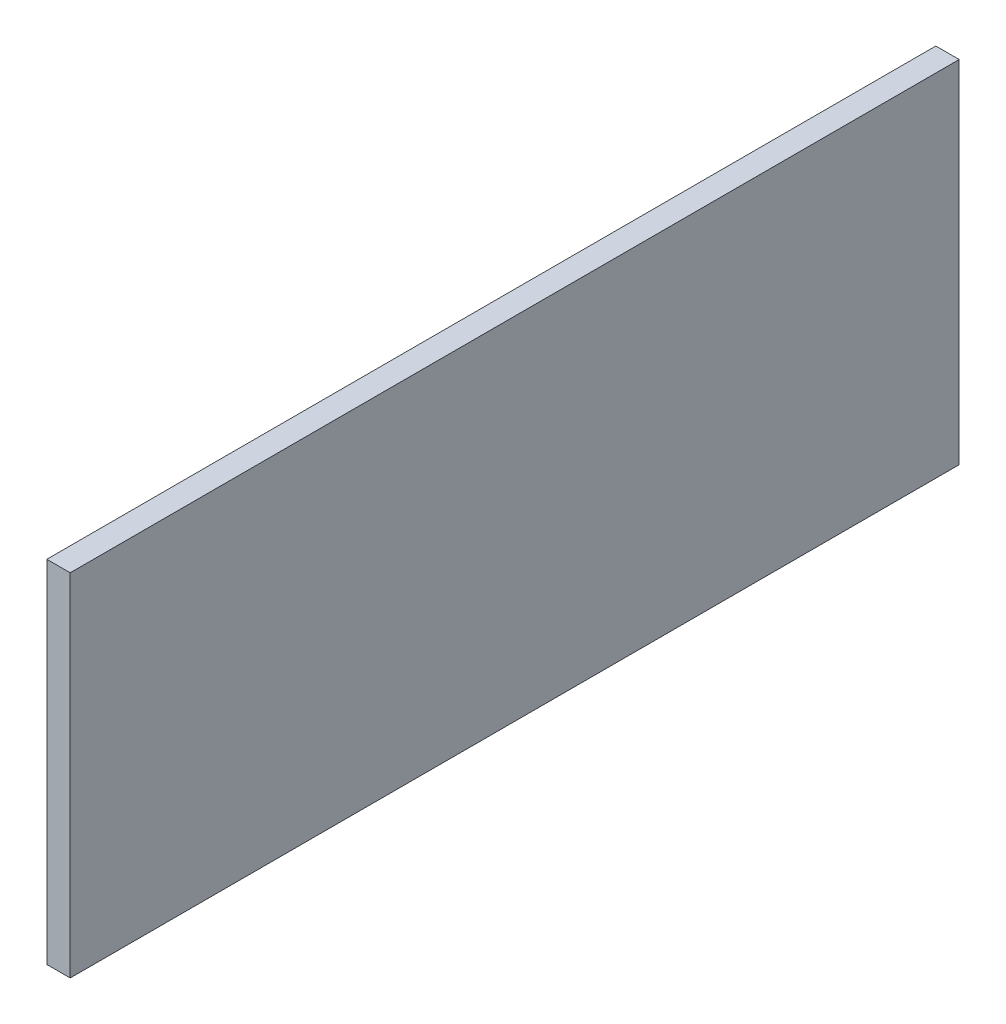
ISO-10303-21;
HEADER;
FILE_DESCRIPTION(('STEP AP214'),'2;1');
FILE_NAME('part.step','',(''),(''),'','','');
FILE_SCHEMA(('AUTOMOTIVE_DESIGN { 1 0 10303 214 1 1 1 1 }'));
ENDSEC;
DATA;
#1=APPLICATION_CONTEXT('core data for automotive mechanical design processes');
#2=APPLICATION_PROTOCOL_DEFINITION('international standard','automotive_design',2000,#1);
#3=PRODUCT_CONTEXT('',#1,'mechanical');
#4=PRODUCT('Part','Part','',(#3));
#5=PRODUCT_RELATED_PRODUCT_CATEGORY('part','',(#4));
#6=PRODUCT_DEFINITION_FORMATION('','',#4);
#7=PRODUCT_DEFINITION_CONTEXT('part definition',#1,'design');
#8=PRODUCT_DEFINITION('design','',#6,#7);
#9=PRODUCT_DEFINITION_SHAPE('','',#8);
#10=(LENGTH_UNIT() NAMED_UNIT(*) SI_UNIT(.MILLI.,.METRE.));
#11=(NAMED_UNIT(*) PLANE_ANGLE_UNIT() SI_UNIT($,.RADIAN.));
#12=(NAMED_UNIT(*) SI_UNIT($,.STERADIAN.) SOLID_ANGLE_UNIT());
#13=UNCERTAINTY_MEASURE_WITH_UNIT(LENGTH_MEASURE(1.E-05),#10,'distance_accuracy_value','');
#14=(GEOMETRIC_REPRESENTATION_CONTEXT(3) GLOBAL_UNCERTAINTY_ASSIGNED_CONTEXT((#13)) GLOBAL_UNIT_ASSIGNED_CONTEXT((#10,
#11,#12)) REPRESENTATION_CONTEXT('',''));
#15=CARTESIAN_POINT('',(0.,0.,0.));
#16=DIRECTION('',(0.,0.,1.));
#17=DIRECTION('',(1.,0.,0.));
#18=AXIS2_PLACEMENT_3D('',#15,#16,#17);
#19=CARTESIAN_POINT('',(10.,-75.0000000000003,-190.));
#20=DIRECTION('',(0.,0.,1.));
#21=DIRECTION('',(1.,0.,0.));
#22=AXIS2_PLACEMENT_3D('',#19,#20,#21);
#23=PLANE('',#22);
#24=DIRECTION('',(0.,1.,0.));
#25=VECTOR('',#24,1.);
#26=CARTESIAN_POINT('',(0.,-75.0000000000003,-190.));
#27=LINE('',#26,#25);
#28=CARTESIAN_POINT('',(0.,-75.0000000000003,-190.));
#29=VERTEX_POINT('',#28);
#30=CARTESIAN_POINT('',(0.,74.9999999999998,-190.));
#31=VERTEX_POINT('',#30);
#32=EDGE_CURVE('E107',#29,#31,#27,.T.);
#33=ORIENTED_EDGE('',*,*,#32,.T.);
#34=DIRECTION('',(-1.,0.,0.));
#35=VECTOR('',#34,1.);
#36=CARTESIAN_POINT('',(10.,74.9999999999998,-190.));
#37=LINE('',#36,#35);
#38=CARTESIAN_POINT('',(10.,74.9999999999998,-190.));
#39=VERTEX_POINT('',#38);
#40=EDGE_CURVE('E11',#39,#31,#37,.T.);
#41=ORIENTED_EDGE('',*,*,#40,.F.);
#42=DIRECTION('',(0.,1.,0.));
#43=VECTOR('',#42,1.);
#44=CARTESIAN_POINT('',(10.,-75.0000000000003,-190.));
#45=LINE('',#44,#43);
#46=CARTESIAN_POINT('',(10.,-75.0000000000003,-190.));
#47=VERTEX_POINT('',#46);
#48=EDGE_CURVE('E91',#47,#39,#45,.T.);
#49=ORIENTED_EDGE('',*,*,#48,.F.);
#50=DIRECTION('',(-1.,0.,0.));
#51=VECTOR('',#50,1.);
#52=CARTESIAN_POINT('',(10.,-75.0000000000003,-190.));
#53=LINE('',#52,#51);
#54=EDGE_CURVE('E103',#47,#29,#53,.T.);
#55=ORIENTED_EDGE('',*,*,#54,.T.);
#56=EDGE_LOOP('',(#33,#41,#49,#55));
#57=FACE_BOUND('',#56,.T.);
#58=ADVANCED_FACE('F39',(#57),#23,.F.);
#59=CARTESIAN_POINT('',(10.,74.9999999999998,190.));
#60=DIRECTION('',(0.,-1.,0.));
#61=DIRECTION('',(0.,0.,-1.));
#62=AXIS2_PLACEMENT_3D('',#59,#60,#61);
#63=PLANE('',#62);
#64=DIRECTION('',(0.,0.,1.));
#65=VECTOR('',#64,1.);
#66=CARTESIAN_POINT('',(0.,74.9999999999998,190.));
#67=LINE('',#66,#65);
#68=CARTESIAN_POINT('',(0.,74.9999999999998,190.));
#69=VERTEX_POINT('',#68);
#70=EDGE_CURVE('E96',#31,#69,#67,.T.);
#71=ORIENTED_EDGE('',*,*,#70,.T.);
#72=DIRECTION('',(-1.,0.,0.));
#73=VECTOR('',#72,1.);
#74=CARTESIAN_POINT('',(10.,74.9999999999998,190.));
#75=LINE('',#74,#73);
#76=CARTESIAN_POINT('',(10.,74.9999999999998,190.));
#77=VERTEX_POINT('',#76);
#78=EDGE_CURVE('E48',#77,#69,#75,.T.);
#79=ORIENTED_EDGE('',*,*,#78,.F.);
#80=DIRECTION('',(0.,0.,1.));
#81=VECTOR('',#80,1.);
#82=CARTESIAN_POINT('',(10.,74.9999999999998,190.));
#83=LINE('',#82,#81);
#84=EDGE_CURVE('E86',#39,#77,#83,.T.);
#85=ORIENTED_EDGE('',*,*,#84,.F.);
#86=ORIENTED_EDGE('',*,*,#40,.T.);
#87=EDGE_LOOP('',(#71,#79,#85,#86));
#88=FACE_BOUND('',#87,.T.);
#89=ADVANCED_FACE('F95',(#88),#63,.F.);
#90=CARTESIAN_POINT('',(10.,-75.0000000000003,190.));
#91=DIRECTION('',(0.,0.,-1.));
#92=DIRECTION('',(-1.,0.,0.));
#93=AXIS2_PLACEMENT_3D('',#90,#91,#92);
#94=PLANE('',#93);
#95=DIRECTION('',(0.,-1.,0.));
#96=VECTOR('',#95,1.);
#97=CARTESIAN_POINT('',(0.,-75.0000000000003,190.));
#98=LINE('',#97,#96);
#99=CARTESIAN_POINT('',(0.,-75.0000000000003,190.));
#100=VERTEX_POINT('',#99);
#101=EDGE_CURVE('E73',#69,#100,#98,.T.);
#102=ORIENTED_EDGE('',*,*,#101,.T.);
#103=DIRECTION('',(-1.,0.,0.));
#104=VECTOR('',#103,1.);
#105=CARTESIAN_POINT('',(10.,-75.0000000000003,190.));
#106=LINE('',#105,#104);
#107=CARTESIAN_POINT('',(10.,-75.0000000000003,190.));
#108=VERTEX_POINT('',#107);
#109=EDGE_CURVE('E98',#108,#100,#106,.T.);
#110=ORIENTED_EDGE('',*,*,#109,.F.);
#111=DIRECTION('',(0.,-1.,0.));
#112=VECTOR('',#111,1.);
#113=CARTESIAN_POINT('',(10.,-75.0000000000003,190.));
#114=LINE('',#113,#112);
#115=EDGE_CURVE('E89',#77,#108,#114,.T.);
#116=ORIENTED_EDGE('',*,*,#115,.F.);
#117=ORIENTED_EDGE('',*,*,#78,.T.);
#118=EDGE_LOOP('',(#102,#110,#116,#117));
#119=FACE_BOUND('',#118,.T.);
#120=ADVANCED_FACE('F99',(#119),#94,.F.);
#121=CARTESIAN_POINT('',(10.,-75.0000000000003,190.));
#122=DIRECTION('',(0.,1.,0.));
#123=DIRECTION('',(0.,0.,1.));
#124=AXIS2_PLACEMENT_3D('',#121,#122,#123);
#125=PLANE('',#124);
#126=DIRECTION('',(0.,0.,-1.));
#127=VECTOR('',#126,1.);
#128=CARTESIAN_POINT('',(0.,-75.0000000000003,190.));
#129=LINE('',#128,#127);
#130=EDGE_CURVE('E79',#100,#29,#129,.T.);
#131=ORIENTED_EDGE('',*,*,#130,.T.);
#132=ORIENTED_EDGE('',*,*,#54,.F.);
#133=DIRECTION('',(0.,0.,-1.));
#134=VECTOR('',#133,1.);
#135=CARTESIAN_POINT('',(10.,-75.0000000000003,190.));
#136=LINE('',#135,#134);
#137=EDGE_CURVE('E56',#108,#47,#136,.T.);
#138=ORIENTED_EDGE('',*,*,#137,.F.);
#139=ORIENTED_EDGE('',*,*,#109,.T.);
#140=EDGE_LOOP('',(#131,#132,#138,#139));
#141=FACE_BOUND('',#140,.T.);
#142=ADVANCED_FACE('F120',(#141),#125,.F.);
#143=CARTESIAN_POINT('',(10.,0.,0.));
#144=DIRECTION('',(-1.,0.,0.));
#145=DIRECTION('',(0.,0.,1.));
#146=AXIS2_PLACEMENT_3D('',#143,#144,#145);
#147=PLANE('',#146);
#148=ORIENTED_EDGE('',*,*,#48,.T.);
#149=ORIENTED_EDGE('',*,*,#84,.T.);
#150=ORIENTED_EDGE('',*,*,#115,.T.);
#151=ORIENTED_EDGE('',*,*,#137,.T.);
#152=EDGE_LOOP('',(#148,#149,#150,#151));
#153=FACE_BOUND('',#152,.T.);
#154=ADVANCED_FACE('F87',(#153),#147,.F.);
#155=CARTESIAN_POINT('',(0.,0.,0.));
#156=DIRECTION('',(-1.,0.,0.));
#157=DIRECTION('',(0.,0.,1.));
#158=AXIS2_PLACEMENT_3D('',#155,#156,#157);
#159=PLANE('',#158);
#160=ORIENTED_EDGE('',*,*,#32,.F.);
#161=ORIENTED_EDGE('',*,*,#130,.F.);
#162=ORIENTED_EDGE('',*,*,#101,.F.);
#163=ORIENTED_EDGE('',*,*,#70,.F.);
#164=EDGE_LOOP('',(#160,#161,#162,#163));
#165=FACE_BOUND('',#164,.T.);
#166=ADVANCED_FACE('F123',(#165),#159,.T.);
#167=CLOSED_SHELL('',(#58,#89,#120,#142,#154,#166));
#168=MANIFOLD_SOLID_BREP('B2',#167);
#169=ADVANCED_BREP_SHAPE_REPRESENTATION('',(#18,#168),#14);
#170=SHAPE_DEFINITION_REPRESENTATION(#9,#169);
ENDSEC;
END-ISO-10303-21;
